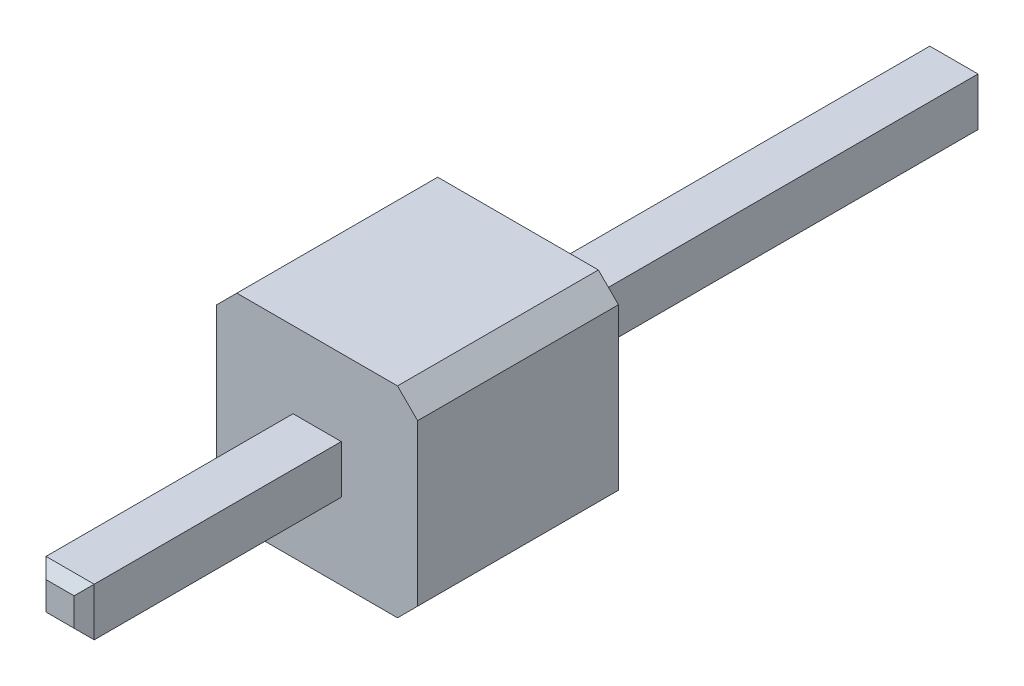
ISO-10303-21;
HEADER;
FILE_DESCRIPTION(('STEP AP214'),'2;1');
FILE_NAME('part.step','',(''),(''),'','','');
FILE_SCHEMA(('AUTOMOTIVE_DESIGN { 1 0 10303 214 1 1 1 1 }'));
ENDSEC;
DATA;
#1=APPLICATION_CONTEXT('core data for automotive mechanical design processes');
#2=APPLICATION_PROTOCOL_DEFINITION('international standard','automotive_design',2000,#1);
#3=PRODUCT_CONTEXT('',#1,'mechanical');
#4=PRODUCT('Part','Part','',(#3));
#5=PRODUCT_RELATED_PRODUCT_CATEGORY('part','',(#4));
#6=PRODUCT_DEFINITION_FORMATION('','',#4);
#7=PRODUCT_DEFINITION_CONTEXT('part definition',#1,'design');
#8=PRODUCT_DEFINITION('design','',#6,#7);
#9=PRODUCT_DEFINITION_SHAPE('','',#8);
#10=(LENGTH_UNIT() NAMED_UNIT(*) SI_UNIT(.MILLI.,.METRE.));
#11=(NAMED_UNIT(*) PLANE_ANGLE_UNIT() SI_UNIT($,.RADIAN.));
#12=(NAMED_UNIT(*) SI_UNIT($,.STERADIAN.) SOLID_ANGLE_UNIT());
#13=UNCERTAINTY_MEASURE_WITH_UNIT(LENGTH_MEASURE(1.E-05),#10,'distance_accuracy_value','');
#14=(GEOMETRIC_REPRESENTATION_CONTEXT(3) GLOBAL_UNCERTAINTY_ASSIGNED_CONTEXT((#13)) GLOBAL_UNIT_ASSIGNED_CONTEXT((#10,
#11,#12)) REPRESENTATION_CONTEXT('',''));
#15=CARTESIAN_POINT('',(0.,0.,0.));
#16=DIRECTION('',(0.,0.,1.));
#17=DIRECTION('',(1.,0.,0.));
#18=AXIS2_PLACEMENT_3D('',#15,#16,#17);
#19=CARTESIAN_POINT('',(0.,-0.175,5.625));
#20=DIRECTION('',(0.,0.707106781186548,-0.707106781186548));
#21=DIRECTION('',(0.,0.707106781186548,0.707106781186548));
#22=AXIS2_PLACEMENT_3D('',#19,#20,#21);
#23=PLANE('',#22);
#24=DIRECTION('',(1.,0.,0.));
#25=VECTOR('',#24,1.);
#26=CARTESIAN_POINT('',(-0.3,-0.3,5.5));
#27=LINE('',#26,#25);
#28=CARTESIAN_POINT('',(-0.3,-0.3,5.5));
#29=VERTEX_POINT('',#28);
#30=CARTESIAN_POINT('',(0.3,-0.3,5.5));
#31=VERTEX_POINT('',#30);
#32=EDGE_CURVE('E154',#29,#31,#27,.T.);
#33=ORIENTED_EDGE('',*,*,#32,.T.);
#34=DIRECTION('',(-0.577350269189626,0.577350269189626,0.577350269189626));
#35=VECTOR('',#34,1.);
#36=CARTESIAN_POINT('',(0.3,-0.3,5.5));
#37=LINE('',#36,#35);
#38=CARTESIAN_POINT('',(0.175,-0.175,5.625));
#39=VERTEX_POINT('',#38);
#40=EDGE_CURVE('E152',#31,#39,#37,.T.);
#41=ORIENTED_EDGE('',*,*,#40,.T.);
#42=DIRECTION('',(-1.,0.,0.));
#43=VECTOR('',#42,1.);
#44=CARTESIAN_POINT('',(0.,-0.175,5.625));
#45=LINE('',#44,#43);
#46=CARTESIAN_POINT('',(-0.175,-0.175,5.625));
#47=VERTEX_POINT('',#46);
#48=EDGE_CURVE('E20',#39,#47,#45,.T.);
#49=ORIENTED_EDGE('',*,*,#48,.T.);
#50=DIRECTION('',(-0.577350269189626,-0.577350269189626,-0.577350269189626));
#51=VECTOR('',#50,1.);
#52=CARTESIAN_POINT('',(-0.175,-0.175,5.625));
#53=LINE('',#52,#51);
#54=EDGE_CURVE('E171',#47,#29,#53,.T.);
#55=ORIENTED_EDGE('',*,*,#54,.T.);
#56=EDGE_LOOP('',(#33,#41,#49,#55));
#57=FACE_BOUND('',#56,.T.);
#58=ADVANCED_FACE('F17',(#57),#23,.F.);
#59=CARTESIAN_POINT('',(0.,0.,5.625));
#60=DIRECTION('',(0.,0.,-1.));
#61=DIRECTION('',(-1.,0.,0.));
#62=AXIS2_PLACEMENT_3D('',#59,#60,#61);
#63=PLANE('',#62);
#64=ORIENTED_EDGE('',*,*,#48,.F.);
#65=DIRECTION('',(0.,1.,0.));
#66=VECTOR('',#65,1.);
#67=CARTESIAN_POINT('',(0.175,0.,5.625));
#68=LINE('',#67,#66);
#69=CARTESIAN_POINT('',(0.175,0.175,5.625));
#70=VERTEX_POINT('',#69);
#71=EDGE_CURVE('E159',#39,#70,#68,.T.);
#72=ORIENTED_EDGE('',*,*,#71,.T.);
#73=DIRECTION('',(1.,0.,0.));
#74=VECTOR('',#73,1.);
#75=CARTESIAN_POINT('',(0.,0.175,5.625));
#76=LINE('',#75,#74);
#77=CARTESIAN_POINT('',(-0.175,0.175,5.625));
#78=VERTEX_POINT('',#77);
#79=EDGE_CURVE('E185',#70,#78,#76,.F.);
#80=ORIENTED_EDGE('',*,*,#79,.T.);
#81=DIRECTION('',(0.,1.,0.));
#82=VECTOR('',#81,1.);
#83=CARTESIAN_POINT('',(-0.175,0.,5.625));
#84=LINE('',#83,#82);
#85=EDGE_CURVE('E164',#78,#47,#84,.F.);
#86=ORIENTED_EDGE('',*,*,#85,.T.);
#87=EDGE_LOOP('',(#64,#72,#80,#86));
#88=FACE_BOUND('',#87,.T.);
#89=ADVANCED_FACE('F161',(#88),#63,.F.);
#90=CARTESIAN_POINT('',(0.175,0.,5.625));
#91=DIRECTION('',(-0.707106781186548,0.,-0.707106781186548));
#92=DIRECTION('',(-0.707106781186548,0.,0.707106781186548));
#93=AXIS2_PLACEMENT_3D('',#90,#91,#92);
#94=PLANE('',#93);
#95=ORIENTED_EDGE('',*,*,#71,.F.);
#96=ORIENTED_EDGE('',*,*,#40,.F.);
#97=DIRECTION('',(0.,1.,0.));
#98=VECTOR('',#97,1.);
#99=CARTESIAN_POINT('',(0.3,-0.3,5.5));
#100=LINE('',#99,#98);
#101=CARTESIAN_POINT('',(0.3,0.3,5.5));
#102=VERTEX_POINT('',#101);
#103=EDGE_CURVE('E180',#31,#102,#100,.T.);
#104=ORIENTED_EDGE('',*,*,#103,.T.);
#105=DIRECTION('',(-0.577350269189626,-0.577350269189626,0.577350269189626));
#106=VECTOR('',#105,1.);
#107=CARTESIAN_POINT('',(0.3,0.3,5.5));
#108=LINE('',#107,#106);
#109=EDGE_CURVE('E168',#102,#70,#108,.T.);
#110=ORIENTED_EDGE('',*,*,#109,.T.);
#111=EDGE_LOOP('',(#95,#96,#104,#110));
#112=FACE_BOUND('',#111,.T.);
#113=ADVANCED_FACE('F166',(#112),#94,.F.);
#114=CARTESIAN_POINT('',(-0.175,0.,5.625));
#115=DIRECTION('',(0.707106781186548,0.,-0.707106781186548));
#116=DIRECTION('',(-0.707106781186548,0.,-0.707106781186548));
#117=AXIS2_PLACEMENT_3D('',#114,#115,#116);
#118=PLANE('',#117);
#119=DIRECTION('',(0.,1.,0.));
#120=VECTOR('',#119,1.);
#121=CARTESIAN_POINT('',(-0.3,-0.3,5.5));
#122=LINE('',#121,#120);
#123=CARTESIAN_POINT('',(-0.3,0.3,5.5));
#124=VERTEX_POINT('',#123);
#125=EDGE_CURVE('E190',#124,#29,#122,.F.);
#126=ORIENTED_EDGE('',*,*,#125,.T.);
#127=ORIENTED_EDGE('',*,*,#54,.F.);
#128=ORIENTED_EDGE('',*,*,#85,.F.);
#129=DIRECTION('',(-0.577350269189626,0.577350269189626,-0.577350269189626));
#130=VECTOR('',#129,1.);
#131=CARTESIAN_POINT('',(-0.175,0.175,5.625));
#132=LINE('',#131,#130);
#133=EDGE_CURVE('E187',#78,#124,#132,.T.);
#134=ORIENTED_EDGE('',*,*,#133,.T.);
#135=EDGE_LOOP('',(#126,#127,#128,#134));
#136=FACE_BOUND('',#135,.T.);
#137=ADVANCED_FACE('F418',(#136),#118,.F.);
#138=CARTESIAN_POINT('',(-0.3,-0.3,5.625));
#139=DIRECTION('',(0.,1.,0.));
#140=DIRECTION('',(0.,0.,1.));
#141=AXIS2_PLACEMENT_3D('',#138,#139,#140);
#142=PLANE('',#141);
#143=DIRECTION('',(0.,0.,1.));
#144=VECTOR('',#143,1.);
#145=CARTESIAN_POINT('',(0.3,-0.3,5.625));
#146=LINE('',#145,#144);
#147=CARTESIAN_POINT('',(0.3,-0.3,2.425));
#148=VERTEX_POINT('',#147);
#149=EDGE_CURVE('E178',#148,#31,#146,.T.);
#150=ORIENTED_EDGE('',*,*,#149,.T.);
#151=ORIENTED_EDGE('',*,*,#32,.F.);
#152=DIRECTION('',(0.,0.,-1.));
#153=VECTOR('',#152,1.);
#154=CARTESIAN_POINT('',(-0.3,-0.3,5.625));
#155=LINE('',#154,#153);
#156=CARTESIAN_POINT('',(-0.3,-0.3,2.425));
#157=VERTEX_POINT('',#156);
#158=EDGE_CURVE('E193',#29,#157,#155,.T.);
#159=ORIENTED_EDGE('',*,*,#158,.T.);
#160=DIRECTION('',(1.,0.,0.));
#161=VECTOR('',#160,1.);
#162=CARTESIAN_POINT('',(-0.3,-0.3,2.425));
#163=LINE('',#162,#161);
#164=EDGE_CURVE('E176',#148,#157,#163,.F.);
#165=ORIENTED_EDGE('',*,*,#164,.F.);
#166=EDGE_LOOP('',(#150,#151,#159,#165));
#167=FACE_BOUND('',#166,.T.);
#168=ADVANCED_FACE('F404',(#167),#142,.F.);
#169=CARTESIAN_POINT('',(0.3,-0.3,5.625));
#170=DIRECTION('',(-1.,0.,0.));
#171=DIRECTION('',(0.,0.,1.));
#172=AXIS2_PLACEMENT_3D('',#169,#170,#171);
#173=PLANE('',#172);
#174=DIRECTION('',(0.,0.,-1.));
#175=VECTOR('',#174,1.);
#176=CARTESIAN_POINT('',(0.3,0.3,5.625));
#177=LINE('',#176,#175);
#178=CARTESIAN_POINT('',(0.3,0.3,2.425));
#179=VERTEX_POINT('',#178);
#180=EDGE_CURVE('E198',#179,#102,#177,.F.);
#181=ORIENTED_EDGE('',*,*,#180,.T.);
#182=ORIENTED_EDGE('',*,*,#103,.F.);
#183=ORIENTED_EDGE('',*,*,#149,.F.);
#184=DIRECTION('',(0.,1.,0.));
#185=VECTOR('',#184,1.);
#186=CARTESIAN_POINT('',(0.3,-0.3,2.425));
#187=LINE('',#186,#185);
#188=EDGE_CURVE('E182',#179,#148,#187,.F.);
#189=ORIENTED_EDGE('',*,*,#188,.F.);
#190=EDGE_LOOP('',(#181,#182,#183,#189));
#191=FACE_BOUND('',#190,.T.);
#192=ADVANCED_FACE('F402',(#191),#173,.F.);
#193=CARTESIAN_POINT('',(0.,0.175,5.625));
#194=DIRECTION('',(0.,-0.707106781186548,-0.707106781186548));
#195=DIRECTION('',(0.,0.707106781186548,-0.707106781186548));
#196=AXIS2_PLACEMENT_3D('',#193,#194,#195);
#197=PLANE('',#196);
#198=DIRECTION('',(1.,0.,0.));
#199=VECTOR('',#198,1.);
#200=CARTESIAN_POINT('',(-0.3,0.3,5.5));
#201=LINE('',#200,#199);
#202=EDGE_CURVE('E201',#102,#124,#201,.F.);
#203=ORIENTED_EDGE('',*,*,#202,.T.);
#204=ORIENTED_EDGE('',*,*,#133,.F.);
#205=ORIENTED_EDGE('',*,*,#79,.F.);
#206=ORIENTED_EDGE('',*,*,#109,.F.);
#207=EDGE_LOOP('',(#203,#204,#205,#206));
#208=FACE_BOUND('',#207,.T.);
#209=ADVANCED_FACE('F415',(#208),#197,.F.);
#210=CARTESIAN_POINT('',(-0.3,-0.3,5.625));
#211=DIRECTION('',(1.,0.,0.));
#212=DIRECTION('',(0.,0.,-1.));
#213=AXIS2_PLACEMENT_3D('',#210,#211,#212);
#214=PLANE('',#213);
#215=ORIENTED_EDGE('',*,*,#158,.F.);
#216=ORIENTED_EDGE('',*,*,#125,.F.);
#217=DIRECTION('',(0.,0.,-1.));
#218=VECTOR('',#217,1.);
#219=CARTESIAN_POINT('',(-0.3,0.3,5.625));
#220=LINE('',#219,#218);
#221=CARTESIAN_POINT('',(-0.3,0.3,2.425));
#222=VERTEX_POINT('',#221);
#223=EDGE_CURVE('E204',#124,#222,#220,.T.);
#224=ORIENTED_EDGE('',*,*,#223,.T.);
#225=DIRECTION('',(0.,1.,0.));
#226=VECTOR('',#225,1.);
#227=CARTESIAN_POINT('',(-0.3,-0.3,2.425));
#228=LINE('',#227,#226);
#229=EDGE_CURVE('E196',#157,#222,#228,.T.);
#230=ORIENTED_EDGE('',*,*,#229,.F.);
#231=EDGE_LOOP('',(#215,#216,#224,#230));
#232=FACE_BOUND('',#231,.T.);
#233=ADVANCED_FACE('F409',(#232),#214,.F.);
#234=CARTESIAN_POINT('',(-0.3,0.3,-5.5));
#235=DIRECTION('',(0.,0.707106781186548,-0.707106781186548));
#236=DIRECTION('',(0.,0.707106781186548,0.707106781186548));
#237=AXIS2_PLACEMENT_3D('',#234,#235,#236);
#238=PLANE('',#237);
#239=DIRECTION('',(0.577350269189626,-0.577350269189626,-0.577350269189626));
#240=VECTOR('',#239,1.);
#241=CARTESIAN_POINT('',(-0.3,0.3,-5.5));
#242=LINE('',#241,#240);
#243=CARTESIAN_POINT('',(-0.3,0.3,-5.5));
#244=VERTEX_POINT('',#243);
#245=CARTESIAN_POINT('',(-0.175,0.175,-5.625));
#246=VERTEX_POINT('',#245);
#247=EDGE_CURVE('E209',#244,#246,#242,.T.);
#248=ORIENTED_EDGE('',*,*,#247,.F.);
#249=DIRECTION('',(1.,0.,0.));
#250=VECTOR('',#249,1.);
#251=CARTESIAN_POINT('',(-0.3,0.3,-5.5));
#252=LINE('',#251,#250);
#253=CARTESIAN_POINT('',(0.3,0.3,-5.5));
#254=VERTEX_POINT('',#253);
#255=EDGE_CURVE('E220',#244,#254,#252,.T.);
#256=ORIENTED_EDGE('',*,*,#255,.T.);
#257=DIRECTION('',(0.577350269189626,0.577350269189626,0.577350269189626));
#258=VECTOR('',#257,1.);
#259=CARTESIAN_POINT('',(0.175,0.175,-5.625));
#260=LINE('',#259,#258);
#261=CARTESIAN_POINT('',(0.175,0.175,-5.625));
#262=VERTEX_POINT('',#261);
#263=EDGE_CURVE('E217',#262,#254,#260,.T.);
#264=ORIENTED_EDGE('',*,*,#263,.F.);
#265=DIRECTION('',(-1.,0.,0.));
#266=VECTOR('',#265,1.);
#267=CARTESIAN_POINT('',(0.,0.175,-5.625));
#268=LINE('',#267,#266);
#269=EDGE_CURVE('E207',#246,#262,#268,.F.);
#270=ORIENTED_EDGE('',*,*,#269,.F.);
#271=EDGE_LOOP('',(#248,#256,#264,#270));
#272=FACE_BOUND('',#271,.T.);
#273=ADVANCED_FACE('F483',(#272),#238,.T.);
#274=CARTESIAN_POINT('',(-0.3,0.3,5.625));
#275=DIRECTION('',(0.,-1.,0.));
#276=DIRECTION('',(0.,0.,-1.));
#277=AXIS2_PLACEMENT_3D('',#274,#275,#276);
#278=PLANE('',#277);
#279=ORIENTED_EDGE('',*,*,#223,.F.);
#280=ORIENTED_EDGE('',*,*,#202,.F.);
#281=ORIENTED_EDGE('',*,*,#180,.F.);
#282=DIRECTION('',(-1.,0.,0.));
#283=VECTOR('',#282,1.);
#284=CARTESIAN_POINT('',(0.,0.3,2.425));
#285=LINE('',#284,#283);
#286=EDGE_CURVE('E240',#179,#222,#285,.T.);
#287=ORIENTED_EDGE('',*,*,#286,.T.);
#288=EDGE_LOOP('',(#279,#280,#281,#287));
#289=FACE_BOUND('',#288,.T.);
#290=ADVANCED_FACE('F413',(#289),#278,.F.);
#291=CARTESIAN_POINT('',(0.,0.,-5.625));
#292=DIRECTION('',(0.,0.,-1.));
#293=DIRECTION('',(-1.,0.,0.));
#294=AXIS2_PLACEMENT_3D('',#291,#292,#293);
#295=PLANE('',#294);
#296=DIRECTION('',(0.,1.,0.));
#297=VECTOR('',#296,1.);
#298=CARTESIAN_POINT('',(0.175,-0.3,-5.625));
#299=LINE('',#298,#297);
#300=CARTESIAN_POINT('',(0.175,-0.175,-5.625));
#301=VERTEX_POINT('',#300);
#302=EDGE_CURVE('E214',#301,#262,#299,.T.);
#303=ORIENTED_EDGE('',*,*,#302,.F.);
#304=DIRECTION('',(1.,0.,0.));
#305=VECTOR('',#304,1.);
#306=CARTESIAN_POINT('',(-0.3,-0.175,-5.625));
#307=LINE('',#306,#305);
#308=CARTESIAN_POINT('',(-0.175,-0.175,-5.625));
#309=VERTEX_POINT('',#308);
#310=EDGE_CURVE('E246',#309,#301,#307,.T.);
#311=ORIENTED_EDGE('',*,*,#310,.F.);
#312=DIRECTION('',(0.,1.,0.));
#313=VECTOR('',#312,1.);
#314=CARTESIAN_POINT('',(-0.175,-0.3,-5.625));
#315=LINE('',#314,#313);
#316=EDGE_CURVE('E212',#246,#309,#315,.F.);
#317=ORIENTED_EDGE('',*,*,#316,.F.);
#318=ORIENTED_EDGE('',*,*,#269,.T.);
#319=EDGE_LOOP('',(#303,#311,#317,#318));
#320=FACE_BOUND('',#319,.T.);
#321=ADVANCED_FACE('F501',(#320),#295,.T.);
#322=CARTESIAN_POINT('',(-0.3,-0.3,-5.5));
#323=DIRECTION('',(-0.707106781186548,0.,-0.707106781186548));
#324=DIRECTION('',(-0.707106781186548,0.,0.707106781186548));
#325=AXIS2_PLACEMENT_3D('',#322,#323,#324);
#326=PLANE('',#325);
#327=ORIENTED_EDGE('',*,*,#247,.T.);
#328=ORIENTED_EDGE('',*,*,#316,.T.);
#329=DIRECTION('',(0.577350269189626,0.577350269189626,-0.577350269189626));
#330=VECTOR('',#329,1.);
#331=CARTESIAN_POINT('',(-0.3,-0.3,-5.5));
#332=LINE('',#331,#330);
#333=CARTESIAN_POINT('',(-0.3,-0.3,-5.5));
#334=VERTEX_POINT('',#333);
#335=EDGE_CURVE('E243',#334,#309,#332,.T.);
#336=ORIENTED_EDGE('',*,*,#335,.F.);
#337=DIRECTION('',(0.,1.,0.));
#338=VECTOR('',#337,1.);
#339=CARTESIAN_POINT('',(-0.3,-0.3,-5.5));
#340=LINE('',#339,#338);
#341=EDGE_CURVE('E252',#334,#244,#340,.T.);
#342=ORIENTED_EDGE('',*,*,#341,.T.);
#343=EDGE_LOOP('',(#327,#328,#336,#342));
#344=FACE_BOUND('',#343,.T.);
#345=ADVANCED_FACE('F510',(#344),#326,.T.);
#346=CARTESIAN_POINT('',(0.3,-0.3,-5.5));
#347=DIRECTION('',(0.707106781186548,0.,-0.707106781186548));
#348=DIRECTION('',(-0.707106781186548,0.,-0.707106781186548));
#349=AXIS2_PLACEMENT_3D('',#346,#347,#348);
#350=PLANE('',#349);
#351=ORIENTED_EDGE('',*,*,#263,.T.);
#352=DIRECTION('',(0.,1.,0.));
#353=VECTOR('',#352,1.);
#354=CARTESIAN_POINT('',(0.3,-0.3,-5.5));
#355=LINE('',#354,#353);
#356=CARTESIAN_POINT('',(0.3,-0.3,-5.5));
#357=VERTEX_POINT('',#356);
#358=EDGE_CURVE('E259',#254,#357,#355,.F.);
#359=ORIENTED_EDGE('',*,*,#358,.T.);
#360=DIRECTION('',(0.577350269189626,-0.577350269189626,0.577350269189626));
#361=VECTOR('',#360,1.);
#362=CARTESIAN_POINT('',(0.175,-0.175,-5.625));
#363=LINE('',#362,#361);
#364=EDGE_CURVE('E249',#301,#357,#363,.T.);
#365=ORIENTED_EDGE('',*,*,#364,.F.);
#366=ORIENTED_EDGE('',*,*,#302,.T.);
#367=EDGE_LOOP('',(#351,#359,#365,#366));
#368=FACE_BOUND('',#367,.T.);
#369=ADVANCED_FACE('F520',(#368),#350,.T.);
#370=CARTESIAN_POINT('',(-0.3,0.3,5.625));
#371=DIRECTION('',(0.,-1.,0.));
#372=DIRECTION('',(0.,0.,-1.));
#373=AXIS2_PLACEMENT_3D('',#370,#371,#372);
#374=PLANE('',#373);
#375=DIRECTION('',(1.,0.,0.));
#376=VECTOR('',#375,1.);
#377=CARTESIAN_POINT('',(-0.3,0.3,-0.0750000000000004));
#378=LINE('',#377,#376);
#379=CARTESIAN_POINT('',(0.3,0.3,-0.0750000000000002));
#380=VERTEX_POINT('',#379);
#381=CARTESIAN_POINT('',(-0.3,0.3,-0.0750000000000003));
#382=VERTEX_POINT('',#381);
#383=EDGE_CURVE('E222',#380,#382,#378,.F.);
#384=ORIENTED_EDGE('',*,*,#383,.F.);
#385=DIRECTION('',(0.,0.,1.));
#386=VECTOR('',#385,1.);
#387=CARTESIAN_POINT('',(0.3,0.3,5.625));
#388=LINE('',#387,#386);
#389=EDGE_CURVE('E263',#380,#254,#388,.F.);
#390=ORIENTED_EDGE('',*,*,#389,.T.);
#391=ORIENTED_EDGE('',*,*,#255,.F.);
#392=DIRECTION('',(0.,0.,-1.));
#393=VECTOR('',#392,1.);
#394=CARTESIAN_POINT('',(-0.3,0.3,5.625));
#395=LINE('',#394,#393);
#396=EDGE_CURVE('E255',#244,#382,#395,.F.);
#397=ORIENTED_EDGE('',*,*,#396,.T.);
#398=EDGE_LOOP('',(#384,#390,#391,#397));
#399=FACE_BOUND('',#398,.T.);
#400=ADVANCED_FACE('F530',(#399),#374,.F.);
#401=CARTESIAN_POINT('',(1.25,1.,-0.075));
#402=DIRECTION('',(0.707106781186548,0.707106781186548,0.));
#403=DIRECTION('',(-0.707106781186548,0.707106781186548,0.));
#404=AXIS2_PLACEMENT_3D('',#401,#402,#403);
#405=PLANE('',#404);
#406=DIRECTION('',(0.707106781186548,-0.707106781186548,0.));
#407=VECTOR('',#406,1.);
#408=CARTESIAN_POINT('',(1.,1.25,2.425));
#409=LINE('',#408,#407);
#410=CARTESIAN_POINT('',(1.,1.25,2.425));
#411=VERTEX_POINT('',#410);
#412=CARTESIAN_POINT('',(1.25,1.,2.425));
#413=VERTEX_POINT('',#412);
#414=EDGE_CURVE('E238',#411,#413,#409,.T.);
#415=ORIENTED_EDGE('',*,*,#414,.T.);
#416=DIRECTION('',(0.,0.,-1.));
#417=VECTOR('',#416,1.);
#418=CARTESIAN_POINT('',(1.25,1.,-0.075));
#419=LINE('',#418,#417);
#420=CARTESIAN_POINT('',(1.25,1.,-0.075));
#421=VERTEX_POINT('',#420);
#422=EDGE_CURVE('E274',#421,#413,#419,.F.);
#423=ORIENTED_EDGE('',*,*,#422,.F.);
#424=DIRECTION('',(-0.707106781186548,0.707106781186548,0.));
#425=VECTOR('',#424,1.);
#426=CARTESIAN_POINT('',(1.25,1.,-0.075));
#427=LINE('',#426,#425);
#428=CARTESIAN_POINT('',(1.,1.25,-0.075));
#429=VERTEX_POINT('',#428);
#430=EDGE_CURVE('E224',#421,#429,#427,.T.);
#431=ORIENTED_EDGE('',*,*,#430,.T.);
#432=DIRECTION('',(0.,0.,-1.));
#433=VECTOR('',#432,1.);
#434=CARTESIAN_POINT('',(1.,1.25,-0.075));
#435=LINE('',#434,#433);
#436=EDGE_CURVE('E269',#429,#411,#435,.F.);
#437=ORIENTED_EDGE('',*,*,#436,.T.);
#438=EDGE_LOOP('',(#415,#423,#431,#437));
#439=FACE_BOUND('',#438,.T.);
#440=ADVANCED_FACE('F342',(#439),#405,.T.);
#441=CARTESIAN_POINT('',(1.,-1.25,-0.075));
#442=DIRECTION('',(-0.707106781186548,0.707106781186548,0.));
#443=DIRECTION('',(-0.707106781186548,-0.707106781186548,0.));
#444=AXIS2_PLACEMENT_3D('',#441,#442,#443);
#445=PLANE('',#444);
#446=DIRECTION('',(0.,0.,-1.));
#447=VECTOR('',#446,1.);
#448=CARTESIAN_POINT('',(1.25,-1.,-0.075));
#449=LINE('',#448,#447);
#450=CARTESIAN_POINT('',(1.25,-1.,2.425));
#451=VERTEX_POINT('',#450);
#452=CARTESIAN_POINT('',(1.25,-1.,-0.075));
#453=VERTEX_POINT('',#452);
#454=EDGE_CURVE('E280',#451,#453,#449,.T.);
#455=ORIENTED_EDGE('',*,*,#454,.F.);
#456=DIRECTION('',(-0.707106781186548,-0.707106781186548,0.));
#457=VECTOR('',#456,1.);
#458=CARTESIAN_POINT('',(1.25,-1.,2.425));
#459=LINE('',#458,#457);
#460=CARTESIAN_POINT('',(1.,-1.25,2.425));
#461=VERTEX_POINT('',#460);
#462=EDGE_CURVE('E232',#451,#461,#459,.T.);
#463=ORIENTED_EDGE('',*,*,#462,.T.);
#464=DIRECTION('',(0.,0.,-1.));
#465=VECTOR('',#464,1.);
#466=CARTESIAN_POINT('',(1.,-1.25,-0.075));
#467=LINE('',#466,#465);
#468=CARTESIAN_POINT('',(1.,-1.25,-0.075));
#469=VERTEX_POINT('',#468);
#470=EDGE_CURVE('E289',#469,#461,#467,.F.);
#471=ORIENTED_EDGE('',*,*,#470,.F.);
#472=DIRECTION('',(-0.707106781186548,-0.707106781186548,0.));
#473=VECTOR('',#472,1.);
#474=CARTESIAN_POINT('',(1.,-1.25,-0.075));
#475=LINE('',#474,#473);
#476=EDGE_CURVE('E226',#453,#469,#475,.T.);
#477=ORIENTED_EDGE('',*,*,#476,.F.);
#478=EDGE_LOOP('',(#455,#463,#471,#477));
#479=FACE_BOUND('',#478,.T.);
#480=ADVANCED_FACE('F347',(#479),#445,.F.);
#481=CARTESIAN_POINT('',(-1.25,-1.,-0.075));
#482=DIRECTION('',(-0.707106781186548,-0.707106781186548,0.));
#483=DIRECTION('',(0.707106781186548,-0.707106781186548,0.));
#484=AXIS2_PLACEMENT_3D('',#481,#482,#483);
#485=PLANE('',#484);
#486=DIRECTION('',(-0.707106781186548,0.707106781186548,0.));
#487=VECTOR('',#486,1.);
#488=CARTESIAN_POINT('',(-1.,-1.25,2.425));
#489=LINE('',#488,#487);
#490=CARTESIAN_POINT('',(-1.,-1.25,2.425));
#491=VERTEX_POINT('',#490);
#492=CARTESIAN_POINT('',(-1.25,-1.,2.425));
#493=VERTEX_POINT('',#492);
#494=EDGE_CURVE('E234',#491,#493,#489,.T.);
#495=ORIENTED_EDGE('',*,*,#494,.T.);
#496=DIRECTION('',(0.,0.,-1.));
#497=VECTOR('',#496,1.);
#498=CARTESIAN_POINT('',(-1.25,-1.,-0.075));
#499=LINE('',#498,#497);
#500=CARTESIAN_POINT('',(-1.25,-1.,-0.075));
#501=VERTEX_POINT('',#500);
#502=EDGE_CURVE('E292',#493,#501,#499,.T.);
#503=ORIENTED_EDGE('',*,*,#502,.T.);
#504=DIRECTION('',(0.707106781186548,-0.707106781186548,0.));
#505=VECTOR('',#504,1.);
#506=CARTESIAN_POINT('',(-1.25,-1.,-0.075));
#507=LINE('',#506,#505);
#508=CARTESIAN_POINT('',(-1.,-1.25,-0.075));
#509=VERTEX_POINT('',#508);
#510=EDGE_CURVE('E228',#501,#509,#507,.T.);
#511=ORIENTED_EDGE('',*,*,#510,.T.);
#512=DIRECTION('',(0.,0.,-1.));
#513=VECTOR('',#512,1.);
#514=CARTESIAN_POINT('',(-1.,-1.25,-0.075));
#515=LINE('',#514,#513);
#516=EDGE_CURVE('E286',#491,#509,#515,.T.);
#517=ORIENTED_EDGE('',*,*,#516,.F.);
#518=EDGE_LOOP('',(#495,#503,#511,#517));
#519=FACE_BOUND('',#518,.T.);
#520=ADVANCED_FACE('F355',(#519),#485,.T.);
#521=CARTESIAN_POINT('',(-1.,1.25,-0.075));
#522=DIRECTION('',(0.707106781186548,-0.707106781186548,0.));
#523=DIRECTION('',(0.707106781186548,0.707106781186548,0.));
#524=AXIS2_PLACEMENT_3D('',#521,#522,#523);
#525=PLANE('',#524);
#526=DIRECTION('',(0.,0.,-1.));
#527=VECTOR('',#526,1.);
#528=CARTESIAN_POINT('',(-1.25,1.,-0.075));
#529=LINE('',#528,#527);
#530=CARTESIAN_POINT('',(-1.25,1.,-0.075));
#531=VERTEX_POINT('',#530);
#532=CARTESIAN_POINT('',(-1.25,1.,2.425));
#533=VERTEX_POINT('',#532);
#534=EDGE_CURVE('E295',#531,#533,#529,.F.);
#535=ORIENTED_EDGE('',*,*,#534,.T.);
#536=DIRECTION('',(0.707106781186548,0.707106781186548,0.));
#537=VECTOR('',#536,1.);
#538=CARTESIAN_POINT('',(-1.25,1.,2.425));
#539=LINE('',#538,#537);
#540=CARTESIAN_POINT('',(-1.,1.25,2.425));
#541=VERTEX_POINT('',#540);
#542=EDGE_CURVE('E236',#533,#541,#539,.T.);
#543=ORIENTED_EDGE('',*,*,#542,.T.);
#544=DIRECTION('',(0.,0.,-1.));
#545=VECTOR('',#544,1.);
#546=CARTESIAN_POINT('',(-1.,1.25,-0.075));
#547=LINE('',#546,#545);
#548=CARTESIAN_POINT('',(-1.,1.25,-0.075));
#549=VERTEX_POINT('',#548);
#550=EDGE_CURVE('E266',#541,#549,#547,.T.);
#551=ORIENTED_EDGE('',*,*,#550,.T.);
#552=DIRECTION('',(0.707106781186548,0.707106781186548,0.));
#553=VECTOR('',#552,1.);
#554=CARTESIAN_POINT('',(-1.,1.25,-0.075));
#555=LINE('',#554,#553);
#556=EDGE_CURVE('E230',#531,#549,#555,.T.);
#557=ORIENTED_EDGE('',*,*,#556,.F.);
#558=EDGE_LOOP('',(#535,#543,#551,#557));
#559=FACE_BOUND('',#558,.T.);
#560=ADVANCED_FACE('F328',(#559),#525,.F.);
#561=CARTESIAN_POINT('',(0.,0.,2.425));
#562=DIRECTION('',(0.,0.,-1.));
#563=DIRECTION('',(-1.,0.,0.));
#564=AXIS2_PLACEMENT_3D('',#561,#562,#563);
#565=PLANE('',#564);
#566=ORIENTED_EDGE('',*,*,#188,.T.);
#567=ORIENTED_EDGE('',*,*,#164,.T.);
#568=ORIENTED_EDGE('',*,*,#229,.T.);
#569=ORIENTED_EDGE('',*,*,#286,.F.);
#570=EDGE_LOOP('',(#566,#567,#568,#569));
#571=FACE_BOUND('',#570,.T.);
#572=ORIENTED_EDGE('',*,*,#414,.F.);
#573=DIRECTION('',(1.,0.,0.));
#574=VECTOR('',#573,1.);
#575=CARTESIAN_POINT('',(-1.25,1.25,2.425));
#576=LINE('',#575,#574);
#577=EDGE_CURVE('E271',#411,#541,#576,.F.);
#578=ORIENTED_EDGE('',*,*,#577,.T.);
#579=ORIENTED_EDGE('',*,*,#542,.F.);
#580=DIRECTION('',(0.,1.,0.));
#581=VECTOR('',#580,1.);
#582=CARTESIAN_POINT('',(-1.25,-1.25,2.425));
#583=LINE('',#582,#581);
#584=EDGE_CURVE('E297',#533,#493,#583,.F.);
#585=ORIENTED_EDGE('',*,*,#584,.T.);
#586=ORIENTED_EDGE('',*,*,#494,.F.);
#587=DIRECTION('',(1.,0.,0.));
#588=VECTOR('',#587,1.);
#589=CARTESIAN_POINT('',(-1.25,-1.25,2.425));
#590=LINE('',#589,#588);
#591=EDGE_CURVE('E283',#461,#491,#590,.F.);
#592=ORIENTED_EDGE('',*,*,#591,.F.);
#593=ORIENTED_EDGE('',*,*,#462,.F.);
#594=DIRECTION('',(0.,1.,0.));
#595=VECTOR('',#594,1.);
#596=CARTESIAN_POINT('',(1.25,-1.25,2.425));
#597=LINE('',#596,#595);
#598=EDGE_CURVE('E277',#413,#451,#597,.F.);
#599=ORIENTED_EDGE('',*,*,#598,.F.);
#600=EDGE_LOOP('',(#572,#578,#579,#585,#586,#592,#593,#599));
#601=FACE_BOUND('',#600,.T.);
#602=ADVANCED_FACE('F331',(#571,#601),#565,.F.);
#603=CARTESIAN_POINT('',(-0.3,-0.3,-5.5));
#604=DIRECTION('',(0.,-0.707106781186548,-0.707106781186548));
#605=DIRECTION('',(0.,0.707106781186548,-0.707106781186548));
#606=AXIS2_PLACEMENT_3D('',#603,#604,#605);
#607=PLANE('',#606);
#608=ORIENTED_EDGE('',*,*,#364,.T.);
#609=DIRECTION('',(1.,0.,0.));
#610=VECTOR('',#609,1.);
#611=CARTESIAN_POINT('',(-0.3,-0.3,-5.5));
#612=LINE('',#611,#610);
#613=EDGE_CURVE('E300',#357,#334,#612,.F.);
#614=ORIENTED_EDGE('',*,*,#613,.T.);
#615=ORIENTED_EDGE('',*,*,#335,.T.);
#616=ORIENTED_EDGE('',*,*,#310,.T.);
#617=EDGE_LOOP('',(#608,#614,#615,#616));
#618=FACE_BOUND('',#617,.T.);
#619=ADVANCED_FACE('F389',(#618),#607,.T.);
#620=CARTESIAN_POINT('',(-0.3,-0.3,5.625));
#621=DIRECTION('',(1.,0.,0.));
#622=DIRECTION('',(0.,0.,-1.));
#623=AXIS2_PLACEMENT_3D('',#620,#621,#622);
#624=PLANE('',#623);
#625=DIRECTION('',(0.,1.,0.));
#626=VECTOR('',#625,1.);
#627=CARTESIAN_POINT('',(-0.3,-0.3,-0.0750000000000004));
#628=LINE('',#627,#626);
#629=CARTESIAN_POINT('',(-0.3,-0.3,-0.0750000000000003));
#630=VERTEX_POINT('',#629);
#631=EDGE_CURVE('E34',#382,#630,#628,.F.);
#632=ORIENTED_EDGE('',*,*,#631,.F.);
#633=ORIENTED_EDGE('',*,*,#396,.F.);
#634=ORIENTED_EDGE('',*,*,#341,.F.);
#635=DIRECTION('',(0.,0.,1.));
#636=VECTOR('',#635,1.);
#637=CARTESIAN_POINT('',(-0.3,-0.3,5.625));
#638=LINE('',#637,#636);
#639=EDGE_CURVE('E303',#334,#630,#638,.T.);
#640=ORIENTED_EDGE('',*,*,#639,.T.);
#641=EDGE_LOOP('',(#632,#633,#634,#640));
#642=FACE_BOUND('',#641,.T.);
#643=ADVANCED_FACE('F385',(#642),#624,.F.);
#644=CARTESIAN_POINT('',(0.3,-0.3,5.625));
#645=DIRECTION('',(-1.,0.,0.));
#646=DIRECTION('',(0.,0.,1.));
#647=AXIS2_PLACEMENT_3D('',#644,#645,#646);
#648=PLANE('',#647);
#649=DIRECTION('',(0.,1.,0.));
#650=VECTOR('',#649,1.);
#651=CARTESIAN_POINT('',(0.3,-0.3,-0.0750000000000004));
#652=LINE('',#651,#650);
#653=CARTESIAN_POINT('',(0.3,-0.3,-0.0750000000000003));
#654=VERTEX_POINT('',#653);
#655=EDGE_CURVE('E261',#654,#380,#652,.T.);
#656=ORIENTED_EDGE('',*,*,#655,.F.);
#657=DIRECTION('',(0.,0.,1.));
#658=VECTOR('',#657,1.);
#659=CARTESIAN_POINT('',(0.3,-0.3,5.625));
#660=LINE('',#659,#658);
#661=EDGE_CURVE('E305',#654,#357,#660,.F.);
#662=ORIENTED_EDGE('',*,*,#661,.T.);
#663=ORIENTED_EDGE('',*,*,#358,.F.);
#664=ORIENTED_EDGE('',*,*,#389,.F.);
#665=EDGE_LOOP('',(#656,#662,#663,#664));
#666=FACE_BOUND('',#665,.T.);
#667=ADVANCED_FACE('F382',(#666),#648,.F.);
#668=CARTESIAN_POINT('',(-1.25,1.25,-0.075));
#669=DIRECTION('',(0.,-1.,0.));
#670=DIRECTION('',(0.,0.,-1.));
#671=AXIS2_PLACEMENT_3D('',#668,#669,#670);
#672=PLANE('',#671);
#673=ORIENTED_EDGE('',*,*,#436,.F.);
#674=DIRECTION('',(-1.,0.,0.));
#675=VECTOR('',#674,1.);
#676=CARTESIAN_POINT('',(0.,1.25,-0.075));
#677=LINE('',#676,#675);
#678=EDGE_CURVE('E308',#549,#429,#677,.F.);
#679=ORIENTED_EDGE('',*,*,#678,.F.);
#680=ORIENTED_EDGE('',*,*,#550,.F.);
#681=ORIENTED_EDGE('',*,*,#577,.F.);
#682=EDGE_LOOP('',(#673,#679,#680,#681));
#683=FACE_BOUND('',#682,.T.);
#684=ADVANCED_FACE('F338',(#683),#672,.F.);
#685=CARTESIAN_POINT('',(1.25,-1.25,-0.075));
#686=DIRECTION('',(1.,0.,0.));
#687=DIRECTION('',(0.,0.,-1.));
#688=AXIS2_PLACEMENT_3D('',#685,#686,#687);
#689=PLANE('',#688);
#690=ORIENTED_EDGE('',*,*,#598,.T.);
#691=ORIENTED_EDGE('',*,*,#454,.T.);
#692=DIRECTION('',(0.,1.,0.));
#693=VECTOR('',#692,1.);
#694=CARTESIAN_POINT('',(1.25,0.,-0.075));
#695=LINE('',#694,#693);
#696=EDGE_CURVE('E311',#421,#453,#695,.F.);
#697=ORIENTED_EDGE('',*,*,#696,.F.);
#698=ORIENTED_EDGE('',*,*,#422,.T.);
#699=EDGE_LOOP('',(#690,#691,#697,#698));
#700=FACE_BOUND('',#699,.T.);
#701=ADVANCED_FACE('F344',(#700),#689,.T.);
#702=CARTESIAN_POINT('',(-1.25,-1.25,-0.075));
#703=DIRECTION('',(0.,-1.,0.));
#704=DIRECTION('',(0.,0.,-1.));
#705=AXIS2_PLACEMENT_3D('',#702,#703,#704);
#706=PLANE('',#705);
#707=DIRECTION('',(-1.,0.,0.));
#708=VECTOR('',#707,1.);
#709=CARTESIAN_POINT('',(0.,-1.25,-0.075));
#710=LINE('',#709,#708);
#711=EDGE_CURVE('E314',#469,#509,#710,.T.);
#712=ORIENTED_EDGE('',*,*,#711,.F.);
#713=ORIENTED_EDGE('',*,*,#470,.T.);
#714=ORIENTED_EDGE('',*,*,#591,.T.);
#715=ORIENTED_EDGE('',*,*,#516,.T.);
#716=EDGE_LOOP('',(#712,#713,#714,#715));
#717=FACE_BOUND('',#716,.T.);
#718=ADVANCED_FACE('F352',(#717),#706,.T.);
#719=CARTESIAN_POINT('',(-1.25,-1.25,-0.075));
#720=DIRECTION('',(1.,0.,0.));
#721=DIRECTION('',(0.,0.,-1.));
#722=AXIS2_PLACEMENT_3D('',#719,#720,#721);
#723=PLANE('',#722);
#724=ORIENTED_EDGE('',*,*,#534,.F.);
#725=DIRECTION('',(0.,1.,0.));
#726=VECTOR('',#725,1.);
#727=CARTESIAN_POINT('',(-1.25,0.,-0.075));
#728=LINE('',#727,#726);
#729=EDGE_CURVE('E26',#501,#531,#728,.T.);
#730=ORIENTED_EDGE('',*,*,#729,.F.);
#731=ORIENTED_EDGE('',*,*,#502,.F.);
#732=ORIENTED_EDGE('',*,*,#584,.F.);
#733=EDGE_LOOP('',(#724,#730,#731,#732));
#734=FACE_BOUND('',#733,.T.);
#735=ADVANCED_FACE('F324',(#734),#723,.F.);
#736=CARTESIAN_POINT('',(-0.3,-0.3,5.625));
#737=DIRECTION('',(0.,1.,0.));
#738=DIRECTION('',(0.,0.,1.));
#739=AXIS2_PLACEMENT_3D('',#736,#737,#738);
#740=PLANE('',#739);
#741=DIRECTION('',(-1.,0.,0.));
#742=VECTOR('',#741,1.);
#743=CARTESIAN_POINT('',(0.,-0.3,-0.075));
#744=LINE('',#743,#742);
#745=EDGE_CURVE('E11',#630,#654,#744,.F.);
#746=ORIENTED_EDGE('',*,*,#745,.F.);
#747=ORIENTED_EDGE('',*,*,#639,.F.);
#748=ORIENTED_EDGE('',*,*,#613,.F.);
#749=ORIENTED_EDGE('',*,*,#661,.F.);
#750=EDGE_LOOP('',(#746,#747,#748,#749));
#751=FACE_BOUND('',#750,.T.);
#752=ADVANCED_FACE('F366',(#751),#740,.F.);
#753=CARTESIAN_POINT('',(0.,0.,-0.075));
#754=DIRECTION('',(0.,0.,-1.));
#755=DIRECTION('',(-1.,0.,0.));
#756=AXIS2_PLACEMENT_3D('',#753,#754,#755);
#757=PLANE('',#756);
#758=ORIENTED_EDGE('',*,*,#631,.T.);
#759=ORIENTED_EDGE('',*,*,#745,.T.);
#760=ORIENTED_EDGE('',*,*,#655,.T.);
#761=ORIENTED_EDGE('',*,*,#383,.T.);
#762=EDGE_LOOP('',(#758,#759,#760,#761));
#763=FACE_BOUND('',#762,.T.);
#764=ORIENTED_EDGE('',*,*,#729,.T.);
#765=ORIENTED_EDGE('',*,*,#556,.T.);
#766=ORIENTED_EDGE('',*,*,#678,.T.);
#767=ORIENTED_EDGE('',*,*,#430,.F.);
#768=ORIENTED_EDGE('',*,*,#696,.T.);
#769=ORIENTED_EDGE('',*,*,#476,.T.);
#770=ORIENTED_EDGE('',*,*,#711,.T.);
#771=ORIENTED_EDGE('',*,*,#510,.F.);
#772=EDGE_LOOP('',(#764,#765,#766,#767,#768,#769,#770,#771));
#773=FACE_BOUND('',#772,.T.);
#774=ADVANCED_FACE('F320',(#763,#773),#757,.T.);
#775=CLOSED_SHELL('',(#58,#89,#113,#137,#168,#192,#209,#233,#273,#290,#321,#345,#369,#400,#440,
#480,#520,#560,#602,#619,#643,#667,#684,#701,#718,#735,#752,#774));
#776=MANIFOLD_SOLID_BREP('B1',#775);
#777=ADVANCED_BREP_SHAPE_REPRESENTATION('',(#18,#776),#14);
#778=SHAPE_DEFINITION_REPRESENTATION(#9,#777);
ENDSEC;
END-ISO-10303-21;
